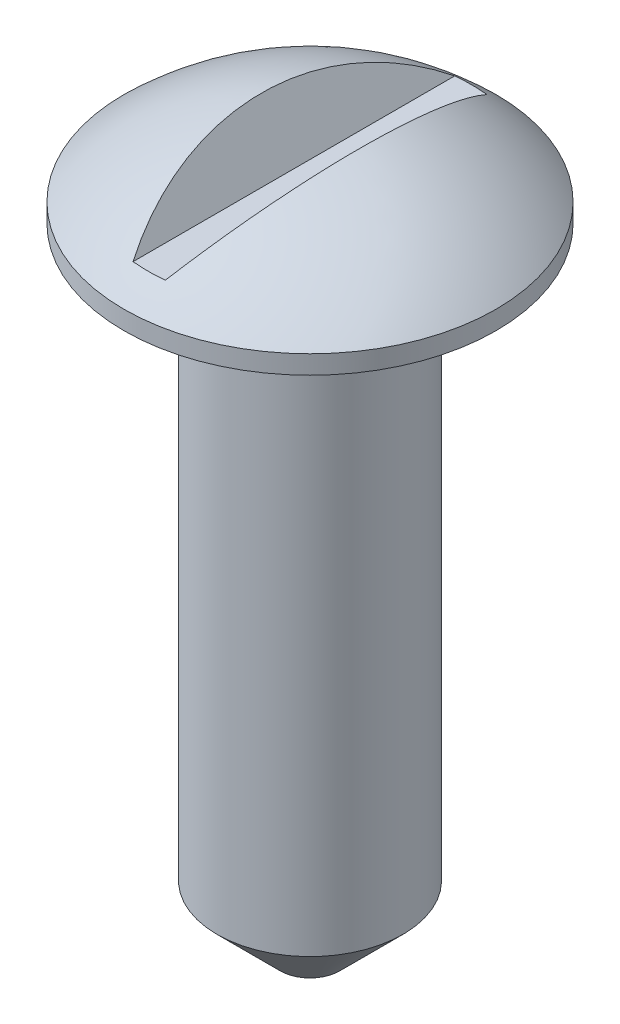
ISO-10303-21;
HEADER;
FILE_DESCRIPTION(('STEP AP214'),'2;1');
FILE_NAME('part.step','',(''),(''),'','','');
FILE_SCHEMA(('AUTOMOTIVE_DESIGN { 1 0 10303 214 1 1 1 1 }'));
ENDSEC;
DATA;
#1=APPLICATION_CONTEXT('core data for automotive mechanical design processes');
#2=APPLICATION_PROTOCOL_DEFINITION('international standard','automotive_design',2000,#1);
#3=PRODUCT_CONTEXT('',#1,'mechanical');
#4=PRODUCT('Part','Part','',(#3));
#5=PRODUCT_RELATED_PRODUCT_CATEGORY('part','',(#4));
#6=PRODUCT_DEFINITION_FORMATION('','',#4);
#7=PRODUCT_DEFINITION_CONTEXT('part definition',#1,'design');
#8=PRODUCT_DEFINITION('design','',#6,#7);
#9=PRODUCT_DEFINITION_SHAPE('','',#8);
#10=(LENGTH_UNIT() NAMED_UNIT(*) SI_UNIT(.MILLI.,.METRE.));
#11=(NAMED_UNIT(*) PLANE_ANGLE_UNIT() SI_UNIT($,.RADIAN.));
#12=(NAMED_UNIT(*) SI_UNIT($,.STERADIAN.) SOLID_ANGLE_UNIT());
#13=UNCERTAINTY_MEASURE_WITH_UNIT(LENGTH_MEASURE(1.E-05),#10,'distance_accuracy_value','');
#14=(GEOMETRIC_REPRESENTATION_CONTEXT(3) GLOBAL_UNCERTAINTY_ASSIGNED_CONTEXT((#13)) GLOBAL_UNIT_ASSIGNED_CONTEXT((#10,
#11,#12)) REPRESENTATION_CONTEXT('',''));
#15=CARTESIAN_POINT('',(0.,0.,0.));
#16=DIRECTION('',(0.,0.,1.));
#17=DIRECTION('',(1.,0.,0.));
#18=AXIS2_PLACEMENT_3D('',#15,#16,#17);
#19=CARTESIAN_POINT('',(0.,1225.,0.));
#20=DIRECTION('',(0.,0.,1.));
#21=DIRECTION('',(1.,0.,0.));
#22=AXIS2_PLACEMENT_3D('',#19,#20,#21);
#23=SPHERICAL_SURFACE('',#22,725.000000000001);
#24=CARTESIAN_POINT('',(0.,1750.,0.));
#25=DIRECTION('',(0.,1.,0.));
#26=DIRECTION('',(0.,0.,1.));
#27=AXIS2_PLACEMENT_3D('',#24,#25,#26);
#28=CIRCLE('',#27,500.);
#29=CARTESIAN_POINT('',(0.,1750.,500.));
#30=VERTEX_POINT('',#29);
#31=EDGE_CURVE('E213',#30,#30,#28,.T.);
#32=ORIENTED_EDGE('',*,*,#31,.T.);
#33=EDGE_LOOP('',(#32));
#34=FACE_BOUND('',#33,.T.);
#35=CARTESIAN_POINT('',(236.1616503602,1380.20999267416,0.));
#36=DIRECTION('',(0.835676163071037,0.549222496329921,0.));
#37=DIRECTION('',(-0.549222496329921,0.835676163071037,0.));
#38=AXIS2_PLACEMENT_3D('',#35,#36,#37);
#39=CIRCLE('',#38,667.65450127535);
#40=CARTESIAN_POINT('',(-43.2963699924422,1805.42273932654,432.272909188345));
#41=VERTEX_POINT('',#40);
#42=CARTESIAN_POINT('',(-43.2963699924422,1805.42273932654,-432.272909188345));
#43=VERTEX_POINT('',#42);
#44=EDGE_CURVE('E72',#41,#43,#39,.F.);
#45=ORIENTED_EDGE('',*,*,#44,.T.);
#46=CARTESIAN_POINT('',(0.,1805.42273932654,0.));
#47=DIRECTION('',(0.,1.,0.));
#48=DIRECTION('',(0.,0.,1.));
#49=AXIS2_PLACEMENT_3D('',#46,#47,#48);
#50=CIRCLE('',#49,434.435776234736);
#51=CARTESIAN_POINT('',(43.2963699924423,1805.42273932654,-432.272909188345));
#52=VERTEX_POINT('',#51);
#53=EDGE_CURVE('E90',#43,#52,#50,.F.);
#54=ORIENTED_EDGE('',*,*,#53,.T.);
#55=CARTESIAN_POINT('',(-236.1616503602,1380.20999267416,0.));
#56=DIRECTION('',(-0.835676163071037,0.549222496329921,0.));
#57=DIRECTION('',(-0.549222496329921,-0.835676163071037,0.));
#58=AXIS2_PLACEMENT_3D('',#55,#56,#57);
#59=CIRCLE('',#58,667.65450127535);
#60=CARTESIAN_POINT('',(43.2963699924423,1805.42273932654,432.272909188345));
#61=VERTEX_POINT('',#60);
#62=EDGE_CURVE('E78',#52,#61,#59,.F.);
#63=ORIENTED_EDGE('',*,*,#62,.T.);
#64=EDGE_CURVE('E84',#61,#41,#50,.F.);
#65=ORIENTED_EDGE('',*,*,#64,.T.);
#66=EDGE_LOOP('',(#45,#54,#63,#65));
#67=FACE_BOUND('',#66,.T.);
#68=ADVANCED_FACE('F49',(#34,#67),#23,.T.);
#69=CARTESIAN_POINT('',(0.,0.,0.));
#70=DIRECTION('',(0.,-1.,0.));
#71=DIRECTION('',(0.,0.,-1.));
#72=AXIS2_PLACEMENT_3D('',#69,#70,#71);
#73=PLANE('',#72);
#74=CARTESIAN_POINT('',(0.,0.,0.));
#75=DIRECTION('',(0.,-1.,0.));
#76=DIRECTION('',(0.,0.,-1.));
#77=AXIS2_PLACEMENT_3D('',#74,#75,#76);
#78=CIRCLE('',#77,79.9999999999994);
#79=CARTESIAN_POINT('',(0.,0.,79.9999999999994));
#80=VERTEX_POINT('',#79);
#81=EDGE_CURVE('E11',#80,#80,#78,.T.);
#82=ORIENTED_EDGE('',*,*,#81,.T.);
#83=EDGE_LOOP('',(#82));
#84=FACE_BOUND('',#83,.T.);
#85=ADVANCED_FACE('F115',(#84),#73,.T.);
#86=CARTESIAN_POINT('',(0.,0.,0.));
#87=DIRECTION('',(0.,1.,0.));
#88=DIRECTION('',(0.,0.,1.));
#89=AXIS2_PLACEMENT_3D('',#86,#87,#88);
#90=CYLINDRICAL_SURFACE('',#89,250.);
#91=CARTESIAN_POINT('',(0.,170.,0.));
#92=DIRECTION('',(0.,-1.,0.));
#93=DIRECTION('',(0.,0.,-1.));
#94=AXIS2_PLACEMENT_3D('',#91,#92,#93);
#95=CIRCLE('',#94,250.);
#96=CARTESIAN_POINT('',(0.,170.,250.));
#97=VERTEX_POINT('',#96);
#98=EDGE_CURVE('E59',#97,#97,#95,.F.);
#99=ORIENTED_EDGE('',*,*,#98,.T.);
#100=EDGE_LOOP('',(#99));
#101=FACE_BOUND('',#100,.T.);
#102=CARTESIAN_POINT('',(0.,1700.,0.));
#103=DIRECTION('',(0.,1.,0.));
#104=DIRECTION('',(0.,0.,1.));
#105=AXIS2_PLACEMENT_3D('',#102,#103,#104);
#106=CIRCLE('',#105,250.);
#107=CARTESIAN_POINT('',(0.,1700.,250.));
#108=VERTEX_POINT('',#107);
#109=EDGE_CURVE('E85',#108,#108,#106,.T.);
#110=ORIENTED_EDGE('',*,*,#109,.F.);
#111=EDGE_LOOP('',(#110));
#112=FACE_BOUND('',#111,.T.);
#113=ADVANCED_FACE('F104',(#101,#112),#90,.T.);
#114=CARTESIAN_POINT('',(-250.,1700.,0.));
#115=DIRECTION('',(0.,-1.,0.));
#116=DIRECTION('',(0.,0.,-1.));
#117=AXIS2_PLACEMENT_3D('',#114,#115,#116);
#118=PLANE('',#117);
#119=ORIENTED_EDGE('',*,*,#109,.T.);
#120=EDGE_LOOP('',(#119));
#121=FACE_BOUND('',#120,.T.);
#122=CARTESIAN_POINT('',(0.,1700.,0.));
#123=DIRECTION('',(0.,1.,0.));
#124=DIRECTION('',(0.,0.,1.));
#125=AXIS2_PLACEMENT_3D('',#122,#123,#124);
#126=CIRCLE('',#125,500.);
#127=CARTESIAN_POINT('',(0.,1700.,500.));
#128=VERTEX_POINT('',#127);
#129=EDGE_CURVE('E216',#128,#128,#126,.T.);
#130=ORIENTED_EDGE('',*,*,#129,.F.);
#131=EDGE_LOOP('',(#130));
#132=FACE_BOUND('',#131,.T.);
#133=ADVANCED_FACE('F126',(#121,#132),#118,.T.);
#134=CARTESIAN_POINT('',(0.,0.,0.));
#135=DIRECTION('',(0.,1.,0.));
#136=DIRECTION('',(0.,0.,1.));
#137=AXIS2_PLACEMENT_3D('',#134,#135,#136);
#138=CYLINDRICAL_SURFACE('',#137,500.);
#139=ORIENTED_EDGE('',*,*,#129,.T.);
#140=EDGE_LOOP('',(#139));
#141=FACE_BOUND('',#140,.T.);
#142=ORIENTED_EDGE('',*,*,#31,.F.);
#143=EDGE_LOOP('',(#142));
#144=FACE_BOUND('',#143,.T.);
#145=ADVANCED_FACE('F129',(#141,#144),#138,.T.);
#146=CARTESIAN_POINT('',(-130.529221516156,1938.15294455705,-3323.54736761148));
#147=DIRECTION('',(0.835676163071037,0.549222496329921,0.));
#148=DIRECTION('',(-0.549222496329921,0.835676163071037,0.));
#149=AXIS2_PLACEMENT_3D('',#146,#147,#148);
#150=PLANE('',#149);
#151=DIRECTION('',(0.,0.,1.));
#152=VECTOR('',#151,1.);
#153=CARTESIAN_POINT('',(-43.2963699924422,1805.42273932654,-3323.54736761148));
#154=LINE('',#153,#152);
#155=EDGE_CURVE('E92',#43,#41,#154,.T.);
#156=ORIENTED_EDGE('',*,*,#155,.F.);
#157=ORIENTED_EDGE('',*,*,#44,.F.);
#158=EDGE_LOOP('',(#156,#157));
#159=FACE_BOUND('',#158,.T.);
#160=ADVANCED_FACE('F133',(#159),#150,.T.);
#161=CARTESIAN_POINT('',(-43.2963699924422,1805.42273932654,-3323.54736761148));
#162=DIRECTION('',(0.,1.,0.));
#163=DIRECTION('',(0.,0.,1.));
#164=AXIS2_PLACEMENT_3D('',#161,#162,#163);
#165=PLANE('',#164);
#166=ORIENTED_EDGE('',*,*,#53,.F.);
#167=ORIENTED_EDGE('',*,*,#155,.T.);
#168=ORIENTED_EDGE('',*,*,#64,.F.);
#169=DIRECTION('',(0.,0.,1.));
#170=VECTOR('',#169,1.);
#171=CARTESIAN_POINT('',(43.2963699924422,1805.42273932654,-3323.54736761148));
#172=LINE('',#171,#170);
#173=EDGE_CURVE('E65',#52,#61,#172,.T.);
#174=ORIENTED_EDGE('',*,*,#173,.F.);
#175=EDGE_LOOP('',(#166,#167,#168,#174));
#176=FACE_BOUND('',#175,.T.);
#177=ADVANCED_FACE('F89',(#176),#165,.T.);
#178=CARTESIAN_POINT('',(130.529221516156,1938.15294455705,-3323.54736761148));
#179=DIRECTION('',(-0.835676163071037,0.549222496329921,0.));
#180=DIRECTION('',(-0.549222496329921,-0.835676163071037,0.));
#181=AXIS2_PLACEMENT_3D('',#178,#179,#180);
#182=PLANE('',#181);
#183=ORIENTED_EDGE('',*,*,#62,.F.);
#184=ORIENTED_EDGE('',*,*,#173,.T.);
#185=EDGE_LOOP('',(#183,#184));
#186=FACE_BOUND('',#185,.T.);
#187=ADVANCED_FACE('F79',(#186),#182,.T.);
#188=CARTESIAN_POINT('',(0.,170.,0.));
#189=DIRECTION('',(0.,1.,0.));
#190=DIRECTION('',(0.,0.,1.));
#191=AXIS2_PLACEMENT_3D('',#188,#189,#190);
#192=CONICAL_SURFACE('',#191,250.,0.78539816339745);
#193=CARTESIAN_POINT('',(0.,0.,79.9999999999994));
#194=CARTESIAN_POINT('',(0.,1.77083333333333,81.7708333333327));
#195=CARTESIAN_POINT('',(0.,3.54166666666666,83.5416666666661));
#196=CARTESIAN_POINT('',(0.,7.08333333333334,87.0833333333327));
#197=CARTESIAN_POINT('',(0.,8.85416666666668,88.8541666666661));
#198=CARTESIAN_POINT('',(0.,12.3958333333334,92.3958333333328));
#199=CARTESIAN_POINT('',(0.,14.1666666666667,94.1666666666661));
#200=CARTESIAN_POINT('',(0.,17.7083333333334,97.7083333333328));
#201=CARTESIAN_POINT('',(0.,19.4791666666667,99.4791666666661));
#202=CARTESIAN_POINT('',(0.,23.0208333333334,103.020833333333));
#203=CARTESIAN_POINT('',(0.,24.7916666666667,104.791666666666));
#204=CARTESIAN_POINT('',(0.,28.3333333333334,108.333333333333));
#205=CARTESIAN_POINT('',(0.,30.1041666666667,110.104166666666));
#206=CARTESIAN_POINT('',(0.,33.6458333333334,113.645833333333));
#207=CARTESIAN_POINT('',(0.,35.4166666666667,115.416666666666));
#208=CARTESIAN_POINT('',(0.,38.9583333333334,118.958333333333));
#209=CARTESIAN_POINT('',(0.,40.7291666666667,120.729166666666));
#210=CARTESIAN_POINT('',(0.,44.2708333333334,124.270833333333));
#211=CARTESIAN_POINT('',(0.,46.0416666666667,126.041666666666));
#212=CARTESIAN_POINT('',(0.,49.5833333333334,129.583333333333));
#213=CARTESIAN_POINT('',(0.,51.3541666666667,131.354166666666));
#214=CARTESIAN_POINT('',(0.,54.8958333333334,134.895833333333));
#215=CARTESIAN_POINT('',(0.,56.6666666666668,136.666666666666));
#216=CARTESIAN_POINT('',(0.,60.2083333333334,140.208333333333));
#217=CARTESIAN_POINT('',(0.,61.9791666666668,141.979166666666));
#218=CARTESIAN_POINT('',(0.,65.5208333333334,145.520833333333));
#219=CARTESIAN_POINT('',(0.,67.2916666666668,147.291666666666));
#220=CARTESIAN_POINT('',(0.,70.8333333333334,150.833333333333));
#221=CARTESIAN_POINT('',(0.,72.6041666666668,152.604166666666));
#222=CARTESIAN_POINT('',(0.,76.1458333333334,156.145833333333));
#223=CARTESIAN_POINT('',(0.,77.9166666666668,157.916666666666));
#224=CARTESIAN_POINT('',(0.,81.4583333333335,161.458333333333));
#225=CARTESIAN_POINT('',(0.,83.2291666666668,163.229166666666));
#226=CARTESIAN_POINT('',(0.,86.7708333333335,166.770833333333));
#227=CARTESIAN_POINT('',(0.,88.5416666666668,168.541666666666));
#228=CARTESIAN_POINT('',(0.,92.0833333333335,172.083333333333));
#229=CARTESIAN_POINT('',(0.,93.8541666666668,173.854166666666));
#230=CARTESIAN_POINT('',(0.,97.3958333333335,177.395833333333));
#231=CARTESIAN_POINT('',(0.,99.1666666666668,179.166666666666));
#232=CARTESIAN_POINT('',(0.,102.708333333333,182.708333333333));
#233=CARTESIAN_POINT('',(0.,104.479166666667,184.479166666666));
#234=CARTESIAN_POINT('',(0.,108.020833333333,188.020833333333));
#235=CARTESIAN_POINT('',(0.,109.791666666667,189.791666666666));
#236=CARTESIAN_POINT('',(0.,113.333333333334,193.333333333333));
#237=CARTESIAN_POINT('',(0.,115.104166666667,195.104166666666));
#238=CARTESIAN_POINT('',(0.,118.645833333333,198.645833333333));
#239=CARTESIAN_POINT('',(0.,120.416666666667,200.416666666667));
#240=CARTESIAN_POINT('',(0.,123.958333333334,203.958333333333));
#241=CARTESIAN_POINT('',(0.,125.729166666667,205.729166666667));
#242=CARTESIAN_POINT('',(0.,129.270833333334,209.270833333333));
#243=CARTESIAN_POINT('',(0.,131.041666666667,211.041666666667));
#244=CARTESIAN_POINT('',(0.,134.583333333334,214.583333333333));
#245=CARTESIAN_POINT('',(0.,136.354166666667,216.354166666667));
#246=CARTESIAN_POINT('',(0.,139.895833333334,219.895833333333));
#247=CARTESIAN_POINT('',(0.,141.666666666667,221.666666666667));
#248=CARTESIAN_POINT('',(0.,145.208333333334,225.208333333333));
#249=CARTESIAN_POINT('',(0.,146.979166666667,226.979166666667));
#250=CARTESIAN_POINT('',(0.,150.520833333334,230.520833333333));
#251=CARTESIAN_POINT('',(0.,152.291666666667,232.291666666667));
#252=CARTESIAN_POINT('',(0.,155.833333333334,235.833333333333));
#253=CARTESIAN_POINT('',(0.,157.604166666667,237.604166666667));
#254=CARTESIAN_POINT('',(0.,161.145833333334,241.145833333333));
#255=CARTESIAN_POINT('',(0.,162.916666666667,242.916666666667));
#256=CARTESIAN_POINT('',(0.,166.458333333334,246.458333333333));
#257=CARTESIAN_POINT('',(0.,168.229166666667,248.229166666667));
#258=CARTESIAN_POINT('',(0.,170.,250.));
#259=B_SPLINE_CURVE_WITH_KNOTS('',3,(#193,#194,#195,#196,#197,#198,#199,#200,#201,#202,#203,
#204,#205,#206,#207,#208,#209,#210,#211,#212,#213,#214,#215,#216,#217,#218,#219,#220,#221,#222,
#223,#224,#225,#226,#227,#228,#229,#230,#231,#232,#233,#234,#235,#236,#237,#238,#239,#240,#241,
#242,#243,#244,#245,#246,#247,#248,#249,#250,#251,#252,#253,#254,#255,#256,#257,#258),
.UNSPECIFIED.,.F.,.F.,(4,2,2,2,2,2,2,2,2,2,2,2,2,2,2,2,2,2,2,2,2,2,2,2,2,2,2,2,2,2,2,2,4),(0.,
7.51300955010708,15.0260191002142,22.5390286503212,30.0520382004284,37.5650477505354,
45.0780573006425,52.5910668507496,60.1040764008567,67.6170859509638,75.1300955010709,
82.643105051178,90.1561146012851,97.6691241513922,105.182133701499,112.695143251606,
120.208152801713,127.721162351821,135.234171901928,142.747181452035,150.260191002142,
157.773200552249,165.286210102356,172.799219652463,180.31222920257,187.825238752677,
195.338248302784,202.851257852891,210.364267402998,217.877276953106,225.390286503213,
232.90329605332,240.416305603427),.UNSPECIFIED.);
#260=EDGE_CURVE('BSEAM52',#80,#97,#259,.T.);
#261=ORIENTED_EDGE('',*,*,#81,.F.);
#262=ORIENTED_EDGE('',*,*,#98,.F.);
#263=ORIENTED_EDGE('',*,*,#260,.T.);
#264=ORIENTED_EDGE('',*,*,#260,.F.);
#265=EDGE_LOOP('',(#261,#263,#262,#264));
#266=FACE_BOUND('',#265,.T.);
#267=ADVANCED_FACE('F52',(#266),#192,.T.);
#268=CLOSED_SHELL('',(#68,#85,#113,#133,#145,#160,#177,#187,#267));
#269=MANIFOLD_SOLID_BREP('B2',#268);
#270=ADVANCED_BREP_SHAPE_REPRESENTATION('',(#18,#269),#14);
#271=SHAPE_DEFINITION_REPRESENTATION(#9,#270);
ENDSEC;
END-ISO-10303-21;
